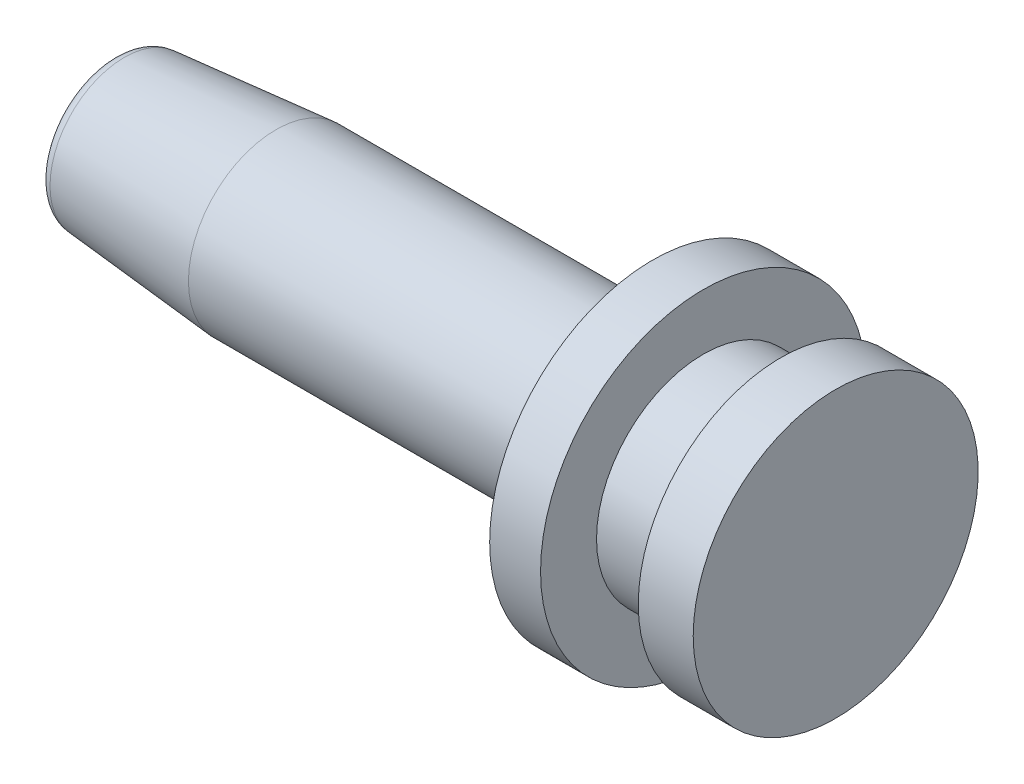
ISO-10303-21;
HEADER;
FILE_DESCRIPTION(('STEP AP214'),'2;1');
FILE_NAME('part.step','',(''),(''),'','','');
FILE_SCHEMA(('AUTOMOTIVE_DESIGN { 1 0 10303 214 1 1 1 1 }'));
ENDSEC;
DATA;
#1=APPLICATION_CONTEXT('core data for automotive mechanical design processes');
#2=APPLICATION_PROTOCOL_DEFINITION('international standard','automotive_design',2000,#1);
#3=PRODUCT_CONTEXT('',#1,'mechanical');
#4=PRODUCT('Part','Part','',(#3));
#5=PRODUCT_RELATED_PRODUCT_CATEGORY('part','',(#4));
#6=PRODUCT_DEFINITION_FORMATION('','',#4);
#7=PRODUCT_DEFINITION_CONTEXT('part definition',#1,'design');
#8=PRODUCT_DEFINITION('design','',#6,#7);
#9=PRODUCT_DEFINITION_SHAPE('','',#8);
#10=(LENGTH_UNIT() NAMED_UNIT(*) SI_UNIT(.MILLI.,.METRE.));
#11=(NAMED_UNIT(*) PLANE_ANGLE_UNIT() SI_UNIT($,.RADIAN.));
#12=(NAMED_UNIT(*) SI_UNIT($,.STERADIAN.) SOLID_ANGLE_UNIT());
#13=UNCERTAINTY_MEASURE_WITH_UNIT(LENGTH_MEASURE(1.E-05),#10,'distance_accuracy_value','');
#14=(GEOMETRIC_REPRESENTATION_CONTEXT(3) GLOBAL_UNCERTAINTY_ASSIGNED_CONTEXT((#13)) GLOBAL_UNIT_ASSIGNED_CONTEXT((#10,
#11,#12)) REPRESENTATION_CONTEXT('',''));
#15=CARTESIAN_POINT('',(0.,0.,0.));
#16=DIRECTION('',(0.,0.,1.));
#17=DIRECTION('',(1.,0.,0.));
#18=AXIS2_PLACEMENT_3D('',#15,#16,#17);
#19=CARTESIAN_POINT('',(35.5,0.,0.));
#20=DIRECTION('',(-1.,0.,0.));
#21=DIRECTION('',(0.,0.,1.));
#22=AXIS2_PLACEMENT_3D('',#19,#20,#21);
#23=PLANE('',#22);
#24=CARTESIAN_POINT('',(35.5,0.,0.));
#25=DIRECTION('',(-1.,0.,0.));
#26=DIRECTION('',(0.,0.,1.));
#27=AXIS2_PLACEMENT_3D('',#24,#25,#26);
#28=CIRCLE('',#27,7.);
#29=CARTESIAN_POINT('',(35.5,0.,7.));
#30=VERTEX_POINT('',#29);
#31=EDGE_CURVE('E45',#30,#30,#28,.T.);
#32=ORIENTED_EDGE('',*,*,#31,.F.);
#33=EDGE_LOOP('',(#32));
#34=FACE_BOUND('',#33,.T.);
#35=ADVANCED_FACE('F34',(#34),#23,.F.);
#36=CARTESIAN_POINT('',(0.,0.,0.));
#37=DIRECTION('',(-1.,0.,0.));
#38=DIRECTION('',(0.,0.,1.));
#39=AXIS2_PLACEMENT_3D('',#36,#37,#38);
#40=CYLINDRICAL_SURFACE('',#39,7.);
#41=CARTESIAN_POINT('',(32.8,0.,0.));
#42=DIRECTION('',(-1.,0.,0.));
#43=DIRECTION('',(0.,0.,1.));
#44=AXIS2_PLACEMENT_3D('',#41,#42,#43);
#45=CIRCLE('',#44,7.);
#46=CARTESIAN_POINT('',(32.8,0.,7.));
#47=VERTEX_POINT('',#46);
#48=EDGE_CURVE('E49',#47,#47,#45,.T.);
#49=ORIENTED_EDGE('',*,*,#48,.F.);
#50=EDGE_LOOP('',(#49));
#51=FACE_BOUND('',#50,.T.);
#52=ORIENTED_EDGE('',*,*,#31,.T.);
#53=EDGE_LOOP('',(#52));
#54=FACE_BOUND('',#53,.T.);
#55=ADVANCED_FACE('F108',(#51,#54),#40,.T.);
#56=CARTESIAN_POINT('',(32.8,7.,0.));
#57=DIRECTION('',(1.,0.,0.));
#58=DIRECTION('',(0.,0.,-1.));
#59=AXIS2_PLACEMENT_3D('',#56,#57,#58);
#60=PLANE('',#59);
#61=CARTESIAN_POINT('',(32.8,0.,0.));
#62=DIRECTION('',(-1.,0.,0.));
#63=DIRECTION('',(0.,0.,1.));
#64=AXIS2_PLACEMENT_3D('',#61,#62,#63);
#65=CIRCLE('',#64,5.25);
#66=CARTESIAN_POINT('',(32.8,0.,5.25));
#67=VERTEX_POINT('',#66);
#68=EDGE_CURVE('E54',#67,#67,#65,.T.);
#69=ORIENTED_EDGE('',*,*,#68,.F.);
#70=EDGE_LOOP('',(#69));
#71=FACE_BOUND('',#70,.T.);
#72=ORIENTED_EDGE('',*,*,#48,.T.);
#73=EDGE_LOOP('',(#72));
#74=FACE_BOUND('',#73,.T.);
#75=ADVANCED_FACE('F102',(#71,#74),#60,.F.);
#76=CARTESIAN_POINT('',(0.,0.,0.));
#77=DIRECTION('',(-1.,0.,0.));
#78=DIRECTION('',(0.,0.,1.));
#79=AXIS2_PLACEMENT_3D('',#76,#77,#78);
#80=CYLINDRICAL_SURFACE('',#79,5.25);
#81=CARTESIAN_POINT('',(29.,0.,0.));
#82=DIRECTION('',(-1.,0.,0.));
#83=DIRECTION('',(0.,0.,1.));
#84=AXIS2_PLACEMENT_3D('',#81,#82,#83);
#85=CIRCLE('',#84,5.25);
#86=CARTESIAN_POINT('',(29.,0.,5.25));
#87=VERTEX_POINT('',#86);
#88=EDGE_CURVE('E57',#87,#87,#85,.T.);
#89=ORIENTED_EDGE('',*,*,#88,.F.);
#90=EDGE_LOOP('',(#89));
#91=FACE_BOUND('',#90,.T.);
#92=ORIENTED_EDGE('',*,*,#68,.T.);
#93=EDGE_LOOP('',(#92));
#94=FACE_BOUND('',#93,.T.);
#95=ADVANCED_FACE('F96',(#91,#94),#80,.T.);
#96=CARTESIAN_POINT('',(29.,5.25,0.));
#97=DIRECTION('',(-1.,0.,0.));
#98=DIRECTION('',(0.,0.,1.));
#99=AXIS2_PLACEMENT_3D('',#96,#97,#98);
#100=PLANE('',#99);
#101=CARTESIAN_POINT('',(29.,0.,0.));
#102=DIRECTION('',(-1.,0.,0.));
#103=DIRECTION('',(0.,0.,1.));
#104=AXIS2_PLACEMENT_3D('',#101,#102,#103);
#105=CIRCLE('',#104,8.);
#106=CARTESIAN_POINT('',(29.,0.,8.));
#107=VERTEX_POINT('',#106);
#108=EDGE_CURVE('E60',#107,#107,#105,.T.);
#109=ORIENTED_EDGE('',*,*,#108,.F.);
#110=EDGE_LOOP('',(#109));
#111=FACE_BOUND('',#110,.T.);
#112=ORIENTED_EDGE('',*,*,#88,.T.);
#113=EDGE_LOOP('',(#112));
#114=FACE_BOUND('',#113,.T.);
#115=ADVANCED_FACE('F90',(#111,#114),#100,.F.);
#116=CARTESIAN_POINT('',(0.,0.,0.));
#117=DIRECTION('',(-1.,0.,0.));
#118=DIRECTION('',(0.,0.,1.));
#119=AXIS2_PLACEMENT_3D('',#116,#117,#118);
#120=CYLINDRICAL_SURFACE('',#119,8.);
#121=CARTESIAN_POINT('',(26.5,0.,0.));
#122=DIRECTION('',(-1.,0.,0.));
#123=DIRECTION('',(0.,0.,1.));
#124=AXIS2_PLACEMENT_3D('',#121,#122,#123);
#125=CIRCLE('',#124,8.);
#126=CARTESIAN_POINT('',(26.5,0.,8.));
#127=VERTEX_POINT('',#126);
#128=EDGE_CURVE('E63',#127,#127,#125,.T.);
#129=ORIENTED_EDGE('',*,*,#128,.F.);
#130=EDGE_LOOP('',(#129));
#131=FACE_BOUND('',#130,.T.);
#132=ORIENTED_EDGE('',*,*,#108,.T.);
#133=EDGE_LOOP('',(#132));
#134=FACE_BOUND('',#133,.T.);
#135=ADVANCED_FACE('F84',(#131,#134),#120,.T.);
#136=CARTESIAN_POINT('',(26.5,0.,0.));
#137=DIRECTION('',(1.,0.,0.));
#138=DIRECTION('',(0.,0.,-1.));
#139=AXIS2_PLACEMENT_3D('',#136,#137,#138);
#140=CONICAL_SURFACE('',#139,8.,0.976582622994463);
#141=CARTESIAN_POINT('',(24.,0.,0.));
#142=DIRECTION('',(-1.,0.,0.));
#143=DIRECTION('',(0.,0.,1.));
#144=AXIS2_PLACEMENT_3D('',#141,#142,#143);
#145=CIRCLE('',#144,4.3);
#146=CARTESIAN_POINT('',(24.,0.,4.3));
#147=VERTEX_POINT('',#146);
#148=EDGE_CURVE('E66',#147,#147,#145,.T.);
#149=ORIENTED_EDGE('',*,*,#148,.F.);
#150=EDGE_LOOP('',(#149));
#151=FACE_BOUND('',#150,.T.);
#152=ORIENTED_EDGE('',*,*,#128,.T.);
#153=EDGE_LOOP('',(#152));
#154=FACE_BOUND('',#153,.T.);
#155=ADVANCED_FACE('F78',(#151,#154),#140,.T.);
#156=CARTESIAN_POINT('',(0.,0.,0.));
#157=DIRECTION('',(-1.,0.,0.));
#158=DIRECTION('',(0.,0.,1.));
#159=AXIS2_PLACEMENT_3D('',#156,#157,#158);
#160=CYLINDRICAL_SURFACE('',#159,4.3);
#161=CARTESIAN_POINT('',(8.,0.,0.));
#162=DIRECTION('',(-1.,0.,0.));
#163=DIRECTION('',(0.,0.,1.));
#164=AXIS2_PLACEMENT_3D('',#161,#162,#163);
#165=CIRCLE('',#164,4.3);
#166=CARTESIAN_POINT('',(8.,0.,4.3));
#167=VERTEX_POINT('',#166);
#168=EDGE_CURVE('E69',#167,#167,#165,.T.);
#169=ORIENTED_EDGE('',*,*,#168,.F.);
#170=EDGE_LOOP('',(#169));
#171=FACE_BOUND('',#170,.T.);
#172=ORIENTED_EDGE('',*,*,#148,.T.);
#173=EDGE_LOOP('',(#172));
#174=FACE_BOUND('',#173,.T.);
#175=ADVANCED_FACE('F75',(#171,#174),#160,.T.);
#176=CARTESIAN_POINT('',(8.,0.,0.));
#177=DIRECTION('',(1.,0.,0.));
#178=DIRECTION('',(0.,0.,-1.));
#179=AXIS2_PLACEMENT_3D('',#176,#177,#178);
#180=CONICAL_SURFACE('',#179,4.3,0.0872777129494612);
#181=CARTESIAN_POINT('',(0.547699829831459,0.,0.));
#182=DIRECTION('',(-1.,0.,0.));
#183=DIRECTION('',(0.,0.,1.));
#184=AXIS2_PLACEMENT_3D('',#181,#182,#183);
#185=CIRCLE('',#184,3.64792373511025);
#186=CARTESIAN_POINT('',(0.547699829831459,0.,3.64792373511025));
#187=VERTEX_POINT('',#186);
#188=EDGE_CURVE('E10',#187,#187,#185,.F.);
#189=ORIENTED_EDGE('',*,*,#188,.T.);
#190=EDGE_LOOP('',(#189));
#191=FACE_BOUND('',#190,.T.);
#192=ORIENTED_EDGE('',*,*,#168,.T.);
#193=EDGE_LOOP('',(#192));
#194=FACE_BOUND('',#193,.T.);
#195=ADVANCED_FACE('F73',(#191,#194),#180,.T.);
#196=CARTESIAN_POINT('',(0.,3.6,0.));
#197=DIRECTION('',(1.,0.,0.));
#198=DIRECTION('',(0.,0.,-1.));
#199=AXIS2_PLACEMENT_3D('',#196,#197,#198);
#200=PLANE('',#199);
#201=CARTESIAN_POINT('',(0.,0.,0.));
#202=DIRECTION('',(1.,0.,0.));
#203=DIRECTION('',(0.,0.,-1.));
#204=AXIS2_PLACEMENT_3D('',#201,#202,#203);
#205=CIRCLE('',#204,3.05020750461258);
#206=CARTESIAN_POINT('',(0.,0.,-3.05020750461258));
#207=VERTEX_POINT('',#206);
#208=EDGE_CURVE('E41',#207,#207,#205,.F.);
#209=ORIENTED_EDGE('',*,*,#208,.T.);
#210=EDGE_LOOP('',(#209));
#211=FACE_BOUND('',#210,.T.);
#212=ADVANCED_FACE('F123',(#211),#200,.F.);
#213=CARTESIAN_POINT('',(0.6,0.,0.));
#214=DIRECTION('',(1.,0.,0.));
#215=DIRECTION('',(0.,0.,-1.));
#216=AXIS2_PLACEMENT_3D('',#213,#214,#215);
#217=TOROIDAL_SURFACE('',#216,3.05020750461258,0.6);
#218=ORIENTED_EDGE('',*,*,#188,.F.);
#219=EDGE_LOOP('',(#218));
#220=FACE_BOUND('',#219,.T.);
#221=ORIENTED_EDGE('',*,*,#208,.F.);
#222=EDGE_LOOP('',(#221));
#223=FACE_BOUND('',#222,.T.);
#224=ADVANCED_FACE('F36',(#220,#223),#217,.T.);
#225=CLOSED_SHELL('',(#35,#55,#75,#95,#115,#135,#155,#175,#195,#212,#224));
#226=MANIFOLD_SOLID_BREP('B2',#225);
#227=ADVANCED_BREP_SHAPE_REPRESENTATION('',(#18,#226),#14);
#228=SHAPE_DEFINITION_REPRESENTATION(#9,#227);
ENDSEC;
END-ISO-10303-21;
